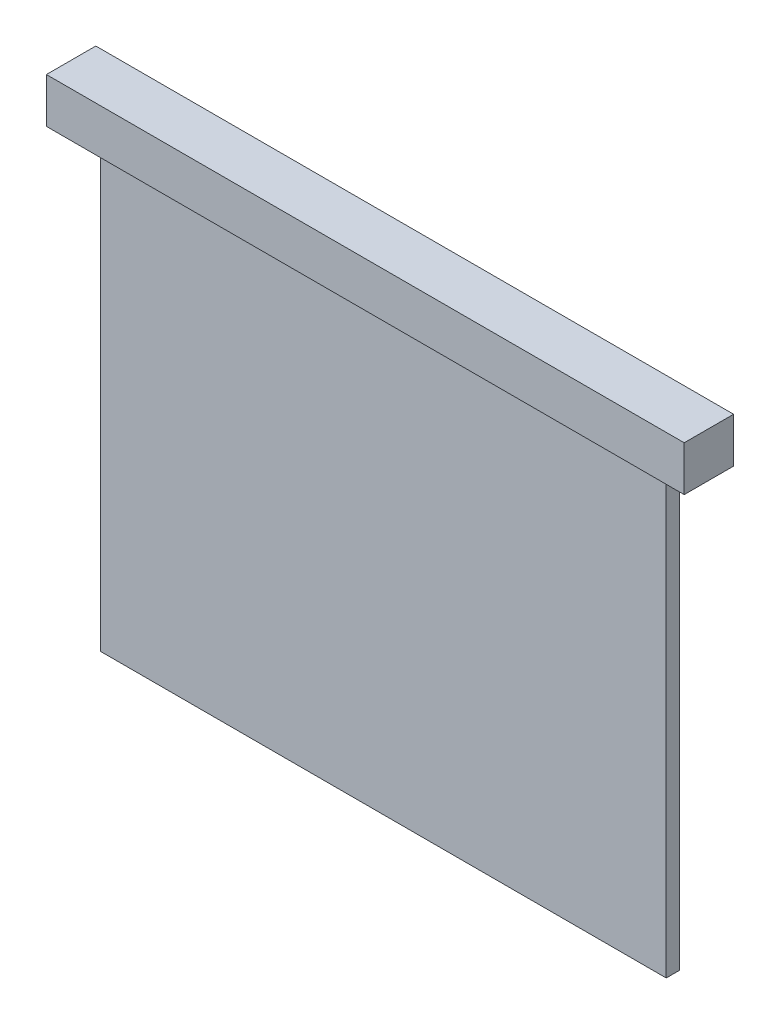
ISO-10303-21;
HEADER;
FILE_DESCRIPTION(('STEP AP214'),'2;1');
FILE_NAME('part.step','',(''),(''),'','','');
FILE_SCHEMA(('AUTOMOTIVE_DESIGN { 1 0 10303 214 1 1 1 1 }'));
ENDSEC;
DATA;
#1=APPLICATION_CONTEXT('core data for automotive mechanical design processes');
#2=APPLICATION_PROTOCOL_DEFINITION('international standard','automotive_design',2000,#1);
#3=PRODUCT_CONTEXT('',#1,'mechanical');
#4=PRODUCT('Part','Part','',(#3));
#5=PRODUCT_RELATED_PRODUCT_CATEGORY('part','',(#4));
#6=PRODUCT_DEFINITION_FORMATION('','',#4);
#7=PRODUCT_DEFINITION_CONTEXT('part definition',#1,'design');
#8=PRODUCT_DEFINITION('design','',#6,#7);
#9=PRODUCT_DEFINITION_SHAPE('','',#8);
#10=(LENGTH_UNIT() NAMED_UNIT(*) SI_UNIT(.MILLI.,.METRE.));
#11=(NAMED_UNIT(*) PLANE_ANGLE_UNIT() SI_UNIT($,.RADIAN.));
#12=(NAMED_UNIT(*) SI_UNIT($,.STERADIAN.) SOLID_ANGLE_UNIT());
#13=UNCERTAINTY_MEASURE_WITH_UNIT(LENGTH_MEASURE(1.E-05),#10,'distance_accuracy_value','');
#14=(GEOMETRIC_REPRESENTATION_CONTEXT(3) GLOBAL_UNCERTAINTY_ASSIGNED_CONTEXT((#13)) GLOBAL_UNIT_ASSIGNED_CONTEXT((#10,
#11,#12)) REPRESENTATION_CONTEXT('',''));
#15=CARTESIAN_POINT('',(0.,0.,0.));
#16=DIRECTION('',(0.,0.,1.));
#17=DIRECTION('',(1.,0.,0.));
#18=AXIS2_PLACEMENT_3D('',#15,#16,#17);
#19=CARTESIAN_POINT('',(-31.5,-24.8,1.5));
#20=DIRECTION('',(1.,0.,0.));
#21=DIRECTION('',(0.,0.,-1.));
#22=AXIS2_PLACEMENT_3D('',#19,#20,#21);
#23=PLANE('',#22);
#24=DIRECTION('',(0.,0.,1.));
#25=VECTOR('',#24,1.);
#26=CARTESIAN_POINT('',(-31.5,24.8,-2.));
#27=LINE('',#26,#25);
#28=CARTESIAN_POINT('',(-31.5,24.8,0.));
#29=VERTEX_POINT('',#28);
#30=CARTESIAN_POINT('',(-31.5,24.8,1.5));
#31=VERTEX_POINT('',#30);
#32=EDGE_CURVE('E11',#29,#31,#27,.T.);
#33=ORIENTED_EDGE('',*,*,#32,.F.);
#34=DIRECTION('',(0.,-1.,0.));
#35=VECTOR('',#34,1.);
#36=CARTESIAN_POINT('',(-31.5,-24.8,0.));
#37=LINE('',#36,#35);
#38=CARTESIAN_POINT('',(-31.5,-24.8,0.));
#39=VERTEX_POINT('',#38);
#40=EDGE_CURVE('E208',#29,#39,#37,.T.);
#41=ORIENTED_EDGE('',*,*,#40,.T.);
#42=DIRECTION('',(0.,0.,-1.));
#43=VECTOR('',#42,1.);
#44=CARTESIAN_POINT('',(-31.5,-24.8,1.5));
#45=LINE('',#44,#43);
#46=CARTESIAN_POINT('',(-31.5,-24.8,1.5));
#47=VERTEX_POINT('',#46);
#48=EDGE_CURVE('E45',#47,#39,#45,.T.);
#49=ORIENTED_EDGE('',*,*,#48,.F.);
#50=DIRECTION('',(0.,-1.,0.));
#51=VECTOR('',#50,1.);
#52=CARTESIAN_POINT('',(-31.5,-24.8,1.5));
#53=LINE('',#52,#51);
#54=EDGE_CURVE('E199',#31,#47,#53,.T.);
#55=ORIENTED_EDGE('',*,*,#54,.F.);
#56=EDGE_LOOP('',(#33,#41,#49,#55));
#57=FACE_BOUND('',#56,.T.);
#58=ADVANCED_FACE('F41',(#57),#23,.F.);
#59=CARTESIAN_POINT('',(31.5,-24.8,1.5));
#60=DIRECTION('',(-1.,0.,0.));
#61=DIRECTION('',(0.,0.,1.));
#62=AXIS2_PLACEMENT_3D('',#59,#60,#61);
#63=PLANE('',#62);
#64=DIRECTION('',(0.,0.,-1.));
#65=VECTOR('',#64,1.);
#66=CARTESIAN_POINT('',(31.5,24.7972796733575,3.5));
#67=LINE('',#66,#65);
#68=CARTESIAN_POINT('',(31.5,24.7972796733575,1.5));
#69=VERTEX_POINT('',#68);
#70=CARTESIAN_POINT('',(31.5,24.7972796733575,0.));
#71=VERTEX_POINT('',#70);
#72=EDGE_CURVE('E50',#69,#71,#67,.T.);
#73=ORIENTED_EDGE('',*,*,#72,.F.);
#74=DIRECTION('',(0.,1.,0.));
#75=VECTOR('',#74,1.);
#76=CARTESIAN_POINT('',(31.5,-24.8,1.5));
#77=LINE('',#76,#75);
#78=CARTESIAN_POINT('',(31.5,-24.8,1.5));
#79=VERTEX_POINT('',#78);
#80=EDGE_CURVE('E195',#79,#69,#77,.T.);
#81=ORIENTED_EDGE('',*,*,#80,.F.);
#82=DIRECTION('',(0.,0.,-1.));
#83=VECTOR('',#82,1.);
#84=CARTESIAN_POINT('',(31.5,-24.8,1.5));
#85=LINE('',#84,#83);
#86=CARTESIAN_POINT('',(31.5,-24.8,0.));
#87=VERTEX_POINT('',#86);
#88=EDGE_CURVE('E202',#79,#87,#85,.T.);
#89=ORIENTED_EDGE('',*,*,#88,.T.);
#90=DIRECTION('',(0.,1.,0.));
#91=VECTOR('',#90,1.);
#92=CARTESIAN_POINT('',(31.5,-24.8,0.));
#93=LINE('',#92,#91);
#94=EDGE_CURVE('E203',#87,#71,#93,.T.);
#95=ORIENTED_EDGE('',*,*,#94,.T.);
#96=EDGE_LOOP('',(#73,#81,#89,#95));
#97=FACE_BOUND('',#96,.T.);
#98=ADVANCED_FACE('F43',(#97),#63,.F.);
#99=CARTESIAN_POINT('',(-31.5,-24.8,1.5));
#100=DIRECTION('',(0.,1.,0.));
#101=DIRECTION('',(0.,0.,1.));
#102=AXIS2_PLACEMENT_3D('',#99,#100,#101);
#103=PLANE('',#102);
#104=DIRECTION('',(1.,0.,0.));
#105=VECTOR('',#104,1.);
#106=CARTESIAN_POINT('',(-31.5,-24.8,0.));
#107=LINE('',#106,#105);
#108=EDGE_CURVE('E79',#39,#87,#107,.T.);
#109=ORIENTED_EDGE('',*,*,#108,.T.);
#110=ORIENTED_EDGE('',*,*,#88,.F.);
#111=DIRECTION('',(1.,0.,0.));
#112=VECTOR('',#111,1.);
#113=CARTESIAN_POINT('',(-31.5,-24.8,1.5));
#114=LINE('',#113,#112);
#115=EDGE_CURVE('E65',#47,#79,#114,.T.);
#116=ORIENTED_EDGE('',*,*,#115,.F.);
#117=ORIENTED_EDGE('',*,*,#48,.T.);
#118=EDGE_LOOP('',(#109,#110,#116,#117));
#119=FACE_BOUND('',#118,.T.);
#120=ADVANCED_FACE('F255',(#119),#103,.F.);
#121=CARTESIAN_POINT('',(0.,0.,1.5));
#122=DIRECTION('',(0.,0.,-1.));
#123=DIRECTION('',(-1.,0.,0.));
#124=AXIS2_PLACEMENT_3D('',#121,#122,#123);
#125=PLANE('',#124);
#126=ORIENTED_EDGE('',*,*,#80,.T.);
#127=CARTESIAN_POINT('',(31.5,24.8,1.5));
#128=VERTEX_POINT('',#127);
#129=EDGE_CURVE('E197',#69,#128,#77,.T.);
#130=ORIENTED_EDGE('',*,*,#129,.T.);
#131=DIRECTION('',(-1.,0.,0.));
#132=VECTOR('',#131,1.);
#133=CARTESIAN_POINT('',(-31.5,24.8,1.5));
#134=LINE('',#133,#132);
#135=EDGE_CURVE('E84',#128,#31,#134,.T.);
#136=ORIENTED_EDGE('',*,*,#135,.T.);
#137=ORIENTED_EDGE('',*,*,#54,.T.);
#138=ORIENTED_EDGE('',*,*,#115,.T.);
#139=EDGE_LOOP('',(#126,#130,#136,#137,#138));
#140=FACE_BOUND('',#139,.T.);
#141=ADVANCED_FACE('F259',(#140),#125,.F.);
#142=CARTESIAN_POINT('',(0.,0.,0.));
#143=DIRECTION('',(0.,0.,-1.));
#144=DIRECTION('',(-1.,0.,0.));
#145=AXIS2_PLACEMENT_3D('',#142,#143,#144);
#146=PLANE('',#145);
#147=ORIENTED_EDGE('',*,*,#94,.F.);
#148=ORIENTED_EDGE('',*,*,#108,.F.);
#149=ORIENTED_EDGE('',*,*,#40,.F.);
#150=DIRECTION('',(-1.,0.,0.));
#151=VECTOR('',#150,1.);
#152=CARTESIAN_POINT('',(-31.5,24.8,0.));
#153=LINE('',#152,#151);
#154=CARTESIAN_POINT('',(31.5,24.8,0.));
#155=VERTEX_POINT('',#154);
#156=EDGE_CURVE('E205',#155,#29,#153,.T.);
#157=ORIENTED_EDGE('',*,*,#156,.F.);
#158=EDGE_CURVE('E191',#71,#155,#93,.T.);
#159=ORIENTED_EDGE('',*,*,#158,.F.);
#160=EDGE_LOOP('',(#147,#148,#149,#157,#159));
#161=FACE_BOUND('',#160,.T.);
#162=ADVANCED_FACE('F224',(#161),#146,.T.);
#163=CARTESIAN_POINT('',(-31.5,24.8,0.));
#164=DIRECTION('',(0.,1.,0.));
#165=DIRECTION('',(0.,0.,1.));
#166=AXIS2_PLACEMENT_3D('',#163,#164,#165);
#167=PLANE('',#166);
#168=DIRECTION('',(0.,0.,1.));
#169=VECTOR('',#168,1.);
#170=CARTESIAN_POINT('',(31.5,24.8,0.));
#171=LINE('',#170,#169);
#172=CARTESIAN_POINT('',(31.5,24.8,-2.));
#173=VERTEX_POINT('',#172);
#174=EDGE_CURVE('E188',#173,#155,#171,.T.);
#175=ORIENTED_EDGE('',*,*,#174,.T.);
#176=ORIENTED_EDGE('',*,*,#156,.T.);
#177=ORIENTED_EDGE('',*,*,#32,.T.);
#178=ORIENTED_EDGE('',*,*,#135,.F.);
#179=CARTESIAN_POINT('',(31.5,24.8,3.5));
#180=VERTEX_POINT('',#179);
#181=EDGE_CURVE('E187',#128,#180,#171,.T.);
#182=ORIENTED_EDGE('',*,*,#181,.T.);
#183=DIRECTION('',(1.,0.,0.));
#184=VECTOR('',#183,1.);
#185=CARTESIAN_POINT('',(-31.5,24.8,3.5));
#186=LINE('',#185,#184);
#187=CARTESIAN_POINT('',(-35.5,24.8,3.5));
#188=VERTEX_POINT('',#187);
#189=EDGE_CURVE('E145',#188,#180,#186,.T.);
#190=ORIENTED_EDGE('',*,*,#189,.F.);
#191=DIRECTION('',(0.,0.,1.));
#192=VECTOR('',#191,1.);
#193=CARTESIAN_POINT('',(-35.5,24.8,-2.));
#194=LINE('',#193,#192);
#195=CARTESIAN_POINT('',(-35.5,24.8,-2.));
#196=VERTEX_POINT('',#195);
#197=EDGE_CURVE('E148',#196,#188,#194,.T.);
#198=ORIENTED_EDGE('',*,*,#197,.F.);
#199=DIRECTION('',(1.,0.,0.));
#200=VECTOR('',#199,1.);
#201=CARTESIAN_POINT('',(-31.5,24.8,-2.));
#202=LINE('',#201,#200);
#203=EDGE_CURVE('E134',#196,#173,#202,.T.);
#204=ORIENTED_EDGE('',*,*,#203,.T.);
#205=EDGE_LOOP('',(#175,#176,#177,#178,#182,#190,#198,#204));
#206=FACE_BOUND('',#205,.T.);
#207=ADVANCED_FACE('F149',(#206),#167,.F.);
#208=CARTESIAN_POINT('',(-31.5,29.8,0.));
#209=DIRECTION('',(0.,1.,0.));
#210=DIRECTION('',(0.,0.,1.));
#211=AXIS2_PLACEMENT_3D('',#208,#209,#210);
#212=PLANE('',#211);
#213=DIRECTION('',(1.,0.,0.));
#214=VECTOR('',#213,1.);
#215=CARTESIAN_POINT('',(-31.5,29.8,3.5));
#216=LINE('',#215,#214);
#217=CARTESIAN_POINT('',(-35.5,29.8,3.5));
#218=VERTEX_POINT('',#217);
#219=CARTESIAN_POINT('',(35.5,29.8,3.5));
#220=VERTEX_POINT('',#219);
#221=EDGE_CURVE('E190',#218,#220,#216,.T.);
#222=ORIENTED_EDGE('',*,*,#221,.T.);
#223=DIRECTION('',(0.,0.,1.));
#224=VECTOR('',#223,1.);
#225=CARTESIAN_POINT('',(35.5,29.8,3.5));
#226=LINE('',#225,#224);
#227=CARTESIAN_POINT('',(35.5,29.8,-2.));
#228=VERTEX_POINT('',#227);
#229=EDGE_CURVE('E173',#228,#220,#226,.T.);
#230=ORIENTED_EDGE('',*,*,#229,.F.);
#231=DIRECTION('',(1.,0.,0.));
#232=VECTOR('',#231,1.);
#233=CARTESIAN_POINT('',(-31.5,29.8,-2.));
#234=LINE('',#233,#232);
#235=CARTESIAN_POINT('',(-35.5,29.8,-2.));
#236=VERTEX_POINT('',#235);
#237=EDGE_CURVE('E144',#236,#228,#234,.T.);
#238=ORIENTED_EDGE('',*,*,#237,.F.);
#239=DIRECTION('',(0.,0.,-1.));
#240=VECTOR('',#239,1.);
#241=CARTESIAN_POINT('',(-35.5,29.8,-2.));
#242=LINE('',#241,#240);
#243=EDGE_CURVE('E159',#218,#236,#242,.T.);
#244=ORIENTED_EDGE('',*,*,#243,.F.);
#245=EDGE_LOOP('',(#222,#230,#238,#244));
#246=FACE_BOUND('',#245,.T.);
#247=ADVANCED_FACE('F237',(#246),#212,.T.);
#248=CARTESIAN_POINT('',(-31.5,0.,-2.));
#249=DIRECTION('',(0.,0.,1.));
#250=DIRECTION('',(1.,0.,0.));
#251=AXIS2_PLACEMENT_3D('',#248,#249,#250);
#252=PLANE('',#251);
#253=ORIENTED_EDGE('',*,*,#237,.T.);
#254=DIRECTION('',(0.,1.,0.));
#255=VECTOR('',#254,1.);
#256=CARTESIAN_POINT('',(35.5,29.8,-2.));
#257=LINE('',#256,#255);
#258=CARTESIAN_POINT('',(35.5,24.7972796733575,-2.));
#259=VERTEX_POINT('',#258);
#260=EDGE_CURVE('E170',#259,#228,#257,.T.);
#261=ORIENTED_EDGE('',*,*,#260,.F.);
#262=DIRECTION('',(-1.,0.,0.));
#263=VECTOR('',#262,1.);
#264=CARTESIAN_POINT('',(35.5,24.7972796733575,-2.));
#265=LINE('',#264,#263);
#266=CARTESIAN_POINT('',(31.5,24.7972796733575,-2.));
#267=VERTEX_POINT('',#266);
#268=EDGE_CURVE('E176',#259,#267,#265,.T.);
#269=ORIENTED_EDGE('',*,*,#268,.T.);
#270=DIRECTION('',(0.,1.,0.));
#271=VECTOR('',#270,1.);
#272=CARTESIAN_POINT('',(31.5,29.8,-2.));
#273=LINE('',#272,#271);
#274=EDGE_CURVE('E141',#267,#173,#273,.T.);
#275=ORIENTED_EDGE('',*,*,#274,.T.);
#276=ORIENTED_EDGE('',*,*,#203,.F.);
#277=DIRECTION('',(0.,-1.,0.));
#278=VECTOR('',#277,1.);
#279=CARTESIAN_POINT('',(-35.5,29.8,-2.));
#280=LINE('',#279,#278);
#281=EDGE_CURVE('E138',#236,#196,#280,.T.);
#282=ORIENTED_EDGE('',*,*,#281,.F.);
#283=EDGE_LOOP('',(#253,#261,#269,#275,#276,#282));
#284=FACE_BOUND('',#283,.T.);
#285=ADVANCED_FACE('F136',(#284),#252,.F.);
#286=CARTESIAN_POINT('',(-31.5,0.,3.5));
#287=DIRECTION('',(0.,0.,1.));
#288=DIRECTION('',(0.,-1.,0.));
#289=AXIS2_PLACEMENT_3D('',#286,#287,#288);
#290=PLANE('',#289);
#291=ORIENTED_EDGE('',*,*,#189,.T.);
#292=DIRECTION('',(0.,-1.,0.));
#293=VECTOR('',#292,1.);
#294=CARTESIAN_POINT('',(31.5,29.8,3.5));
#295=LINE('',#294,#293);
#296=CARTESIAN_POINT('',(31.5,24.7972796733575,3.5));
#297=VERTEX_POINT('',#296);
#298=EDGE_CURVE('E163',#180,#297,#295,.T.);
#299=ORIENTED_EDGE('',*,*,#298,.T.);
#300=DIRECTION('',(-1.,0.,0.));
#301=VECTOR('',#300,1.);
#302=CARTESIAN_POINT('',(35.5,24.7972796733575,3.5));
#303=LINE('',#302,#301);
#304=CARTESIAN_POINT('',(35.5,24.7972796733575,3.5));
#305=VERTEX_POINT('',#304);
#306=EDGE_CURVE('E184',#305,#297,#303,.T.);
#307=ORIENTED_EDGE('',*,*,#306,.F.);
#308=DIRECTION('',(0.,-1.,0.));
#309=VECTOR('',#308,1.);
#310=CARTESIAN_POINT('',(35.5,29.8,3.5));
#311=LINE('',#310,#309);
#312=EDGE_CURVE('E165',#220,#305,#311,.T.);
#313=ORIENTED_EDGE('',*,*,#312,.F.);
#314=ORIENTED_EDGE('',*,*,#221,.F.);
#315=DIRECTION('',(0.,1.,0.));
#316=VECTOR('',#315,1.);
#317=CARTESIAN_POINT('',(-35.5,29.8,3.5));
#318=LINE('',#317,#316);
#319=EDGE_CURVE('E154',#188,#218,#318,.T.);
#320=ORIENTED_EDGE('',*,*,#319,.F.);
#321=EDGE_LOOP('',(#291,#299,#307,#313,#314,#320));
#322=FACE_BOUND('',#321,.T.);
#323=ADVANCED_FACE('F234',(#322),#290,.T.);
#324=CARTESIAN_POINT('',(31.5,0.,0.));
#325=DIRECTION('',(1.,0.,0.));
#326=DIRECTION('',(0.,0.,-1.));
#327=AXIS2_PLACEMENT_3D('',#324,#325,#326);
#328=PLANE('',#327);
#329=EDGE_CURVE('E178',#71,#267,#67,.T.);
#330=ORIENTED_EDGE('',*,*,#329,.F.);
#331=ORIENTED_EDGE('',*,*,#158,.T.);
#332=ORIENTED_EDGE('',*,*,#174,.F.);
#333=ORIENTED_EDGE('',*,*,#274,.F.);
#334=EDGE_LOOP('',(#330,#331,#332,#333));
#335=FACE_BOUND('',#334,.T.);
#336=ADVANCED_FACE('F219',(#335),#328,.F.);
#337=CARTESIAN_POINT('',(35.5,24.7972796733575,3.5));
#338=DIRECTION('',(0.,1.,0.));
#339=DIRECTION('',(0.,0.,1.));
#340=AXIS2_PLACEMENT_3D('',#337,#338,#339);
#341=PLANE('',#340);
#342=EDGE_CURVE('E179',#297,#69,#67,.T.);
#343=ORIENTED_EDGE('',*,*,#342,.T.);
#344=ORIENTED_EDGE('',*,*,#72,.T.);
#345=ORIENTED_EDGE('',*,*,#329,.T.);
#346=ORIENTED_EDGE('',*,*,#268,.F.);
#347=DIRECTION('',(0.,0.,-1.));
#348=VECTOR('',#347,1.);
#349=CARTESIAN_POINT('',(35.5,24.7972796733575,3.5));
#350=LINE('',#349,#348);
#351=EDGE_CURVE('E168',#305,#259,#350,.T.);
#352=ORIENTED_EDGE('',*,*,#351,.F.);
#353=ORIENTED_EDGE('',*,*,#306,.T.);
#354=EDGE_LOOP('',(#343,#344,#345,#346,#352,#353));
#355=FACE_BOUND('',#354,.T.);
#356=ADVANCED_FACE('F215',(#355),#341,.F.);
#357=CARTESIAN_POINT('',(35.5,0.,0.));
#358=DIRECTION('',(1.,0.,0.));
#359=DIRECTION('',(0.,0.,-1.));
#360=AXIS2_PLACEMENT_3D('',#357,#358,#359);
#361=PLANE('',#360);
#362=ORIENTED_EDGE('',*,*,#312,.T.);
#363=ORIENTED_EDGE('',*,*,#351,.T.);
#364=ORIENTED_EDGE('',*,*,#260,.T.);
#365=ORIENTED_EDGE('',*,*,#229,.T.);
#366=EDGE_LOOP('',(#362,#363,#364,#365));
#367=FACE_BOUND('',#366,.T.);
#368=ADVANCED_FACE('F240',(#367),#361,.T.);
#369=ORIENTED_EDGE('',*,*,#181,.F.);
#370=ORIENTED_EDGE('',*,*,#129,.F.);
#371=ORIENTED_EDGE('',*,*,#342,.F.);
#372=ORIENTED_EDGE('',*,*,#298,.F.);
#373=EDGE_LOOP('',(#369,#370,#371,#372));
#374=FACE_BOUND('',#373,.T.);
#375=ADVANCED_FACE('F230',(#374),#328,.F.);
#376=CARTESIAN_POINT('',(-35.5,0.,0.));
#377=DIRECTION('',(-1.,0.,0.));
#378=DIRECTION('',(0.,0.,1.));
#379=AXIS2_PLACEMENT_3D('',#376,#377,#378);
#380=PLANE('',#379);
#381=ORIENTED_EDGE('',*,*,#281,.T.);
#382=ORIENTED_EDGE('',*,*,#197,.T.);
#383=ORIENTED_EDGE('',*,*,#319,.T.);
#384=ORIENTED_EDGE('',*,*,#243,.T.);
#385=EDGE_LOOP('',(#381,#382,#383,#384));
#386=FACE_BOUND('',#385,.T.);
#387=ADVANCED_FACE('F157',(#386),#380,.T.);
#388=CLOSED_SHELL('',(#58,#98,#120,#141,#162,#207,#247,#285,#323,#336,#356,#368,#375,#387));
#389=MANIFOLD_SOLID_BREP('B2',#388);
#390=ADVANCED_BREP_SHAPE_REPRESENTATION('',(#18,#389),#14);
#391=SHAPE_DEFINITION_REPRESENTATION(#9,#390);
ENDSEC;
END-ISO-10303-21;
